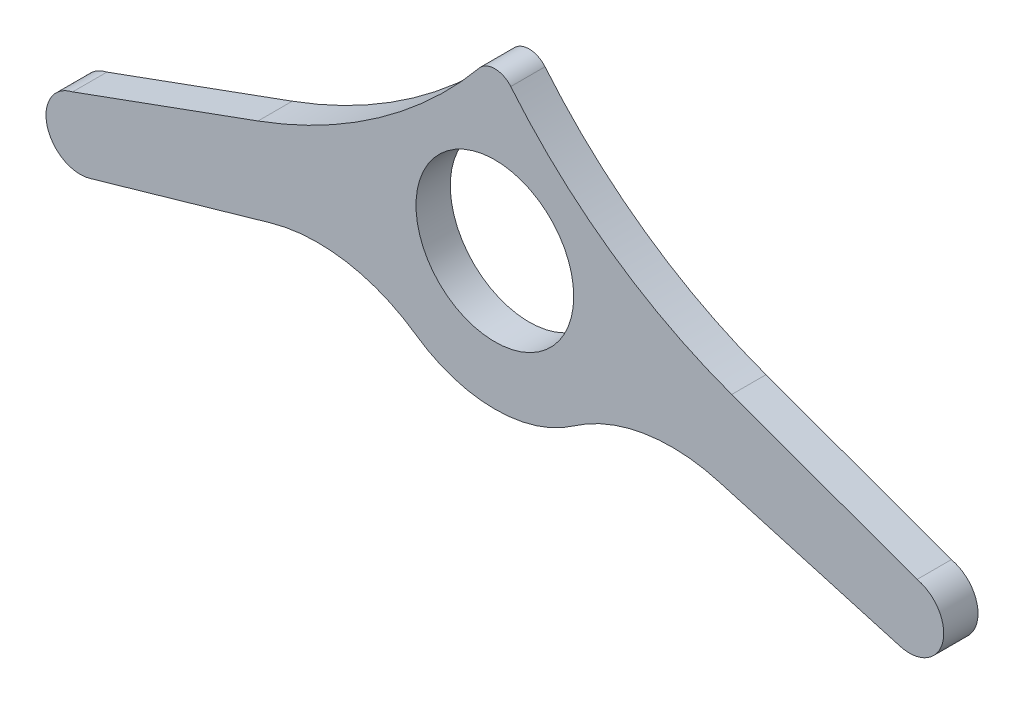
ISO-10303-21;
HEADER;
FILE_DESCRIPTION(('STEP AP214'),'2;1');
FILE_NAME('part.step','',(''),(''),'','','');
FILE_SCHEMA(('AUTOMOTIVE_DESIGN { 1 0 10303 214 1 1 1 1 }'));
ENDSEC;
DATA;
#1=APPLICATION_CONTEXT('core data for automotive mechanical design processes');
#2=APPLICATION_PROTOCOL_DEFINITION('international standard','automotive_design',2000,#1);
#3=PRODUCT_CONTEXT('',#1,'mechanical');
#4=PRODUCT('Part','Part','',(#3));
#5=PRODUCT_RELATED_PRODUCT_CATEGORY('part','',(#4));
#6=PRODUCT_DEFINITION_FORMATION('','',#4);
#7=PRODUCT_DEFINITION_CONTEXT('part definition',#1,'design');
#8=PRODUCT_DEFINITION('design','',#6,#7);
#9=PRODUCT_DEFINITION_SHAPE('','',#8);
#10=(LENGTH_UNIT() NAMED_UNIT(*) SI_UNIT(.MILLI.,.METRE.));
#11=(NAMED_UNIT(*) PLANE_ANGLE_UNIT() SI_UNIT($,.RADIAN.));
#12=(NAMED_UNIT(*) SI_UNIT($,.STERADIAN.) SOLID_ANGLE_UNIT());
#13=UNCERTAINTY_MEASURE_WITH_UNIT(LENGTH_MEASURE(1.E-05),#10,'distance_accuracy_value','');
#14=(GEOMETRIC_REPRESENTATION_CONTEXT(3) GLOBAL_UNCERTAINTY_ASSIGNED_CONTEXT((#13)) GLOBAL_UNIT_ASSIGNED_CONTEXT((#10,
#11,#12)) REPRESENTATION_CONTEXT('',''));
#15=CARTESIAN_POINT('',(0.,0.,0.));
#16=DIRECTION('',(0.,0.,1.));
#17=DIRECTION('',(1.,0.,0.));
#18=AXIS2_PLACEMENT_3D('',#15,#16,#17);
#19=CARTESIAN_POINT('',(60.1925199285785,69.6070614393523,5.));
#20=DIRECTION('',(0.,0.,-1.));
#21=DIRECTION('',(-1.,0.,0.));
#22=AXIS2_PLACEMENT_3D('',#19,#20,#21);
#23=CYLINDRICAL_SURFACE('',#22,75.);
#24=CARTESIAN_POINT('',(60.1925199285785,69.6070614393523,0.));
#25=DIRECTION('',(0.,0.,1.));
#26=DIRECTION('',(1.,0.,0.));
#27=AXIS2_PLACEMENT_3D('',#24,#25,#26);
#28=CIRCLE('',#27,75.);
#29=CARTESIAN_POINT('',(2.31509692032995,21.9079639015136,0.));
#30=VERTEX_POINT('',#29);
#31=CARTESIAN_POINT('',(34.5410091791538,-0.869885119590949,0.));
#32=VERTEX_POINT('',#31);
#33=EDGE_CURVE('E170',#30,#32,#28,.T.);
#34=ORIENTED_EDGE('',*,*,#33,.F.);
#35=DIRECTION('',(0.,0.,-1.));
#36=VECTOR('',#35,1.);
#37=CARTESIAN_POINT('',(2.31509692032995,21.9079639015136,5.));
#38=LINE('',#37,#36);
#39=CARTESIAN_POINT('',(2.31509692032995,21.9079639015136,5.));
#40=VERTEX_POINT('',#39);
#41=EDGE_CURVE('E11',#40,#30,#38,.T.);
#42=ORIENTED_EDGE('',*,*,#41,.F.);
#43=CARTESIAN_POINT('',(60.1925199285785,69.6070614393523,5.));
#44=DIRECTION('',(0.,0.,1.));
#45=DIRECTION('',(1.,0.,0.));
#46=AXIS2_PLACEMENT_3D('',#43,#44,#45);
#47=CIRCLE('',#46,75.);
#48=CARTESIAN_POINT('',(34.5410091791538,-0.869885119590949,5.));
#49=VERTEX_POINT('',#48);
#50=EDGE_CURVE('E216',#40,#49,#47,.T.);
#51=ORIENTED_EDGE('',*,*,#50,.T.);
#52=DIRECTION('',(0.,0.,-1.));
#53=VECTOR('',#52,1.);
#54=CARTESIAN_POINT('',(34.5410091791538,-0.869885119590949,5.));
#55=LINE('',#54,#53);
#56=EDGE_CURVE('E109',#49,#32,#55,.T.);
#57=ORIENTED_EDGE('',*,*,#56,.T.);
#58=EDGE_LOOP('',(#34,#42,#51,#57));
#59=FACE_BOUND('',#58,.T.);
#60=ADVANCED_FACE('F45',(#59),#23,.F.);
#61=CARTESIAN_POINT('',(0.,20.,5.));
#62=DIRECTION('',(0.,0.,-1.));
#63=DIRECTION('',(-1.,0.,0.));
#64=AXIS2_PLACEMENT_3D('',#61,#62,#63);
#65=CYLINDRICAL_SURFACE('',#64,3.);
#66=CARTESIAN_POINT('',(0.,20.,0.));
#67=DIRECTION('',(0.,0.,1.));
#68=DIRECTION('',(1.,0.,0.));
#69=AXIS2_PLACEMENT_3D('',#66,#67,#68);
#70=CIRCLE('',#69,3.);
#71=CARTESIAN_POINT('',(-2.31509692032995,21.9079639015136,0.));
#72=VERTEX_POINT('',#71);
#73=EDGE_CURVE('E174',#72,#30,#70,.F.);
#74=ORIENTED_EDGE('',*,*,#73,.F.);
#75=DIRECTION('',(0.,0.,-1.));
#76=VECTOR('',#75,1.);
#77=CARTESIAN_POINT('',(-2.31509692032995,21.9079639015136,5.));
#78=LINE('',#77,#76);
#79=CARTESIAN_POINT('',(-2.31509692032995,21.9079639015136,5.));
#80=VERTEX_POINT('',#79);
#81=EDGE_CURVE('E54',#80,#72,#78,.T.);
#82=ORIENTED_EDGE('',*,*,#81,.F.);
#83=CARTESIAN_POINT('',(0.,20.,5.));
#84=DIRECTION('',(0.,0.,1.));
#85=DIRECTION('',(1.,0.,0.));
#86=AXIS2_PLACEMENT_3D('',#83,#84,#85);
#87=CIRCLE('',#86,3.);
#88=EDGE_CURVE('E257',#80,#40,#87,.F.);
#89=ORIENTED_EDGE('',*,*,#88,.T.);
#90=ORIENTED_EDGE('',*,*,#41,.T.);
#91=EDGE_LOOP('',(#74,#82,#89,#90));
#92=FACE_BOUND('',#91,.T.);
#93=ADVANCED_FACE('F256',(#92),#65,.T.);
#94=CARTESIAN_POINT('',(-60.1925199285785,69.6070614393523,5.));
#95=DIRECTION('',(0.,0.,-1.));
#96=DIRECTION('',(-1.,0.,0.));
#97=AXIS2_PLACEMENT_3D('',#94,#95,#96);
#98=CYLINDRICAL_SURFACE('',#97,75.);
#99=CARTESIAN_POINT('',(-60.1925199285785,69.6070614393523,0.));
#100=DIRECTION('',(0.,0.,1.));
#101=DIRECTION('',(1.,0.,0.));
#102=AXIS2_PLACEMENT_3D('',#99,#100,#101);
#103=CIRCLE('',#102,75.);
#104=CARTESIAN_POINT('',(-34.5410091791538,-0.869885119590949,0.));
#105=VERTEX_POINT('',#104);
#106=EDGE_CURVE('E178',#72,#105,#103,.F.);
#107=ORIENTED_EDGE('',*,*,#106,.T.);
#108=DIRECTION('',(0.,0.,-1.));
#109=VECTOR('',#108,1.);
#110=CARTESIAN_POINT('',(-34.5410091791538,-0.869885119590949,5.));
#111=LINE('',#110,#109);
#112=CARTESIAN_POINT('',(-34.5410091791538,-0.869885119590949,5.));
#113=VERTEX_POINT('',#112);
#114=EDGE_CURVE('E239',#113,#105,#111,.T.);
#115=ORIENTED_EDGE('',*,*,#114,.F.);
#116=CARTESIAN_POINT('',(-60.1925199285785,69.6070614393523,5.));
#117=DIRECTION('',(0.,0.,1.));
#118=DIRECTION('',(1.,0.,0.));
#119=AXIS2_PLACEMENT_3D('',#116,#117,#118);
#120=CIRCLE('',#119,75.);
#121=EDGE_CURVE('E247',#80,#113,#120,.F.);
#122=ORIENTED_EDGE('',*,*,#121,.F.);
#123=ORIENTED_EDGE('',*,*,#81,.T.);
#124=EDGE_LOOP('',(#107,#115,#122,#123));
#125=FACE_BOUND('',#124,.T.);
#126=ADVANCED_FACE('F245',(#125),#98,.F.);
#127=CARTESIAN_POINT('',(-3.7609548305087,10.3331384724116,5.));
#128=DIRECTION('',(-0.342020143325663,0.93969262078591,0.));
#129=DIRECTION('',(-0.93969262078591,-0.342020143325663,0.));
#130=AXIS2_PLACEMENT_3D('',#127,#128,#129);
#131=PLANE('',#130);
#132=DIRECTION('',(0.939692620785911,0.342020143325663,0.));
#133=VECTOR('',#132,1.);
#134=CARTESIAN_POINT('',(-3.7609548305087,10.3331384724116,0.));
#135=LINE('',#134,#133);
#136=CARTESIAN_POINT('',(-61.5755879459816,-10.7096670866412,0.));
#137=VERTEX_POINT('',#136);
#138=EDGE_CURVE('E182',#137,#105,#135,.T.);
#139=ORIENTED_EDGE('',*,*,#138,.F.);
#140=DIRECTION('',(0.,0.,-1.));
#141=VECTOR('',#140,1.);
#142=CARTESIAN_POINT('',(-61.5755879459816,-10.7096670866412,5.));
#143=LINE('',#142,#141);
#144=CARTESIAN_POINT('',(-61.5755879459816,-10.7096670866412,5.));
#145=VERTEX_POINT('',#144);
#146=EDGE_CURVE('E236',#145,#137,#143,.T.);
#147=ORIENTED_EDGE('',*,*,#146,.F.);
#148=DIRECTION('',(0.939692620785911,0.342020143325663,0.));
#149=VECTOR('',#148,1.);
#150=CARTESIAN_POINT('',(-3.7609548305087,10.3331384724116,5.));
#151=LINE('',#150,#149);
#152=EDGE_CURVE('E268',#145,#113,#151,.T.);
#153=ORIENTED_EDGE('',*,*,#152,.T.);
#154=ORIENTED_EDGE('',*,*,#114,.T.);
#155=EDGE_LOOP('',(#139,#147,#153,#154));
#156=FACE_BOUND('',#155,.T.);
#157=ADVANCED_FACE('F309',(#156),#131,.T.);
#158=CARTESIAN_POINT('',(-60.4587448686565,-15.5833373197028,5.));
#159=DIRECTION('',(0.,0.,-1.));
#160=DIRECTION('',(-1.,0.,0.));
#161=AXIS2_PLACEMENT_3D('',#158,#159,#160);
#162=CYLINDRICAL_SURFACE('',#161,5.);
#163=CARTESIAN_POINT('',(-60.4587448686565,-15.5833373197028,0.));
#164=DIRECTION('',(0.,0.,1.));
#165=DIRECTION('',(1.,0.,0.));
#166=AXIS2_PLACEMENT_3D('',#163,#164,#165);
#167=CIRCLE('',#166,5.);
#168=CARTESIAN_POINT('',(-59.0805580895715,-20.3896457993944,0.));
#169=VERTEX_POINT('',#168);
#170=EDGE_CURVE('E186',#169,#137,#167,.F.);
#171=ORIENTED_EDGE('',*,*,#170,.F.);
#172=DIRECTION('',(0.,0.,-1.));
#173=VECTOR('',#172,1.);
#174=CARTESIAN_POINT('',(-59.0805580895715,-20.3896457993944,5.));
#175=LINE('',#174,#173);
#176=CARTESIAN_POINT('',(-59.0805580895715,-20.3896457993944,5.));
#177=VERTEX_POINT('',#176);
#178=EDGE_CURVE('E233',#177,#169,#175,.T.);
#179=ORIENTED_EDGE('',*,*,#178,.F.);
#180=CARTESIAN_POINT('',(-60.4587448686565,-15.5833373197028,5.));
#181=DIRECTION('',(0.,0.,1.));
#182=DIRECTION('',(1.,0.,0.));
#183=AXIS2_PLACEMENT_3D('',#180,#181,#182);
#184=CIRCLE('',#183,5.);
#185=EDGE_CURVE('E272',#177,#145,#184,.F.);
#186=ORIENTED_EDGE('',*,*,#185,.T.);
#187=ORIENTED_EDGE('',*,*,#146,.T.);
#188=EDGE_LOOP('',(#171,#179,#186,#187));
#189=FACE_BOUND('',#188,.T.);
#190=ADVANCED_FACE('F305',(#189),#162,.T.);
#191=CARTESIAN_POINT('',(0.913731409069728,-3.18656011378087,5.));
#192=DIRECTION('',(0.275637355817,-0.961261695938319,0.));
#193=DIRECTION('',(0.961261695938319,0.275637355817,0.));
#194=AXIS2_PLACEMENT_3D('',#191,#192,#193);
#195=PLANE('',#194);
#196=DIRECTION('',(-0.961261695938319,-0.275637355817,0.));
#197=VECTOR('',#196,1.);
#198=CARTESIAN_POINT('',(0.913731409069728,-3.18656011378087,0.));
#199=LINE('',#198,#197);
#200=CARTESIAN_POINT('',(-32.7065540298084,-12.8270218312732,0.));
#201=VERTEX_POINT('',#200);
#202=EDGE_CURVE('E190',#201,#169,#199,.T.);
#203=ORIENTED_EDGE('',*,*,#202,.F.);
#204=DIRECTION('',(0.,0.,-1.));
#205=VECTOR('',#204,1.);
#206=CARTESIAN_POINT('',(-32.7065540298084,-12.8270218312732,5.));
#207=LINE('',#206,#205);
#208=CARTESIAN_POINT('',(-32.7065540298084,-12.8270218312732,5.));
#209=VERTEX_POINT('',#208);
#210=EDGE_CURVE('E230',#209,#201,#207,.T.);
#211=ORIENTED_EDGE('',*,*,#210,.F.);
#212=DIRECTION('',(-0.961261695938319,-0.275637355817,0.));
#213=VECTOR('',#212,1.);
#214=CARTESIAN_POINT('',(0.913731409069728,-3.18656011378087,5.));
#215=LINE('',#214,#213);
#216=EDGE_CURVE('E276',#209,#177,#215,.T.);
#217=ORIENTED_EDGE('',*,*,#216,.T.);
#218=ORIENTED_EDGE('',*,*,#178,.T.);
#219=EDGE_LOOP('',(#203,#211,#217,#218));
#220=FACE_BOUND('',#219,.T.);
#221=ADVANCED_FACE('F302',(#220),#195,.T.);
#222=CARTESIAN_POINT('',(-25.8156201343834,-36.8585642297312,5.));
#223=DIRECTION('',(0.,0.,-1.));
#224=DIRECTION('',(-1.,0.,0.));
#225=AXIS2_PLACEMENT_3D('',#222,#223,#224);
#226=CYLINDRICAL_SURFACE('',#225,25.);
#227=CARTESIAN_POINT('',(-25.8156201343834,-36.8585642297312,0.));
#228=DIRECTION('',(0.,0.,1.));
#229=DIRECTION('',(1.,0.,0.));
#230=AXIS2_PLACEMENT_3D('',#227,#228,#229);
#231=CIRCLE('',#230,25.);
#232=CARTESIAN_POINT('',(-11.4736089486148,-16.3815841021027,0.));
#233=VERTEX_POINT('',#232);
#234=EDGE_CURVE('E194',#201,#233,#231,.F.);
#235=ORIENTED_EDGE('',*,*,#234,.T.);
#236=DIRECTION('',(0.,0.,-1.));
#237=VECTOR('',#236,1.);
#238=CARTESIAN_POINT('',(-11.4736089486148,-16.3815841021027,5.));
#239=LINE('',#238,#237);
#240=CARTESIAN_POINT('',(-11.4736089486148,-16.3815841021027,5.));
#241=VERTEX_POINT('',#240);
#242=EDGE_CURVE('E226',#241,#233,#239,.T.);
#243=ORIENTED_EDGE('',*,*,#242,.F.);
#244=CARTESIAN_POINT('',(-25.8156201343834,-36.8585642297312,5.));
#245=DIRECTION('',(0.,0.,1.));
#246=DIRECTION('',(1.,0.,0.));
#247=AXIS2_PLACEMENT_3D('',#244,#245,#246);
#248=CIRCLE('',#247,25.);
#249=EDGE_CURVE('E280',#209,#241,#248,.F.);
#250=ORIENTED_EDGE('',*,*,#249,.F.);
#251=ORIENTED_EDGE('',*,*,#210,.T.);
#252=EDGE_LOOP('',(#235,#243,#250,#251));
#253=FACE_BOUND('',#252,.T.);
#254=ADVANCED_FACE('F299',(#253),#226,.F.);
#255=CARTESIAN_POINT('',(0.,0.,5.));
#256=DIRECTION('',(0.,0.,-1.));
#257=DIRECTION('',(-1.,0.,0.));
#258=AXIS2_PLACEMENT_3D('',#255,#256,#257);
#259=CYLINDRICAL_SURFACE('',#258,20.);
#260=CARTESIAN_POINT('',(0.,0.,0.));
#261=DIRECTION('',(0.,0.,1.));
#262=DIRECTION('',(1.,0.,0.));
#263=AXIS2_PLACEMENT_3D('',#260,#261,#262);
#264=CIRCLE('',#263,20.);
#265=CARTESIAN_POINT('',(11.4736089486148,-16.3815841021028,0.));
#266=VERTEX_POINT('',#265);
#267=EDGE_CURVE('E197',#233,#266,#264,.T.);
#268=ORIENTED_EDGE('',*,*,#267,.T.);
#269=DIRECTION('',(0.,0.,-1.));
#270=VECTOR('',#269,1.);
#271=CARTESIAN_POINT('',(11.4736089486148,-16.3815841021028,5.));
#272=LINE('',#271,#270);
#273=CARTESIAN_POINT('',(11.4736089486148,-16.3815841021028,5.));
#274=VERTEX_POINT('',#273);
#275=EDGE_CURVE('E223',#274,#266,#272,.T.);
#276=ORIENTED_EDGE('',*,*,#275,.F.);
#277=CARTESIAN_POINT('',(0.,0.,5.));
#278=DIRECTION('',(0.,0.,1.));
#279=DIRECTION('',(1.,0.,0.));
#280=AXIS2_PLACEMENT_3D('',#277,#278,#279);
#281=CIRCLE('',#280,20.);
#282=EDGE_CURVE('E283',#241,#274,#281,.T.);
#283=ORIENTED_EDGE('',*,*,#282,.F.);
#284=ORIENTED_EDGE('',*,*,#242,.T.);
#285=EDGE_LOOP('',(#268,#276,#283,#284));
#286=FACE_BOUND('',#285,.T.);
#287=ADVANCED_FACE('F294',(#286),#259,.T.);
#288=CARTESIAN_POINT('',(25.8156201343834,-36.8585642297312,5.));
#289=DIRECTION('',(0.,0.,-1.));
#290=DIRECTION('',(-1.,0.,0.));
#291=AXIS2_PLACEMENT_3D('',#288,#289,#290);
#292=CYLINDRICAL_SURFACE('',#291,25.);
#293=CARTESIAN_POINT('',(25.8156201343834,-36.8585642297312,0.));
#294=DIRECTION('',(0.,0.,1.));
#295=DIRECTION('',(1.,0.,0.));
#296=AXIS2_PLACEMENT_3D('',#293,#294,#295);
#297=CIRCLE('',#296,25.);
#298=CARTESIAN_POINT('',(32.7065540298084,-12.8270218312732,0.));
#299=VERTEX_POINT('',#298);
#300=EDGE_CURVE('E201',#299,#266,#297,.T.);
#301=ORIENTED_EDGE('',*,*,#300,.F.);
#302=DIRECTION('',(0.,0.,-1.));
#303=VECTOR('',#302,1.);
#304=CARTESIAN_POINT('',(32.7065540298084,-12.8270218312732,5.));
#305=LINE('',#304,#303);
#306=CARTESIAN_POINT('',(32.7065540298084,-12.8270218312732,5.));
#307=VERTEX_POINT('',#306);
#308=EDGE_CURVE('E156',#307,#299,#305,.T.);
#309=ORIENTED_EDGE('',*,*,#308,.F.);
#310=CARTESIAN_POINT('',(25.8156201343834,-36.8585642297312,5.));
#311=DIRECTION('',(0.,0.,1.));
#312=DIRECTION('',(1.,0.,0.));
#313=AXIS2_PLACEMENT_3D('',#310,#311,#312);
#314=CIRCLE('',#313,25.);
#315=EDGE_CURVE('E147',#307,#274,#314,.T.);
#316=ORIENTED_EDGE('',*,*,#315,.T.);
#317=ORIENTED_EDGE('',*,*,#275,.T.);
#318=EDGE_LOOP('',(#301,#309,#316,#317));
#319=FACE_BOUND('',#318,.T.);
#320=ADVANCED_FACE('F288',(#319),#292,.F.);
#321=CARTESIAN_POINT('',(-0.913731409069728,-3.18656011378087,5.));
#322=DIRECTION('',(0.275637355817,0.961261695938319,0.));
#323=DIRECTION('',(-0.961261695938319,0.275637355817,0.));
#324=AXIS2_PLACEMENT_3D('',#321,#322,#323);
#325=PLANE('',#324);
#326=DIRECTION('',(0.961261695938319,-0.275637355817,0.));
#327=VECTOR('',#326,1.);
#328=CARTESIAN_POINT('',(-0.913731409069728,-3.18656011378087,0.));
#329=LINE('',#328,#327);
#330=CARTESIAN_POINT('',(59.0805580895715,-20.3896457993944,0.));
#331=VERTEX_POINT('',#330);
#332=EDGE_CURVE('E154',#299,#331,#329,.T.);
#333=ORIENTED_EDGE('',*,*,#332,.T.);
#334=DIRECTION('',(0.,0.,-1.));
#335=VECTOR('',#334,1.);
#336=CARTESIAN_POINT('',(59.0805580895715,-20.3896457993944,5.));
#337=LINE('',#336,#335);
#338=CARTESIAN_POINT('',(59.0805580895715,-20.3896457993944,5.));
#339=VERTEX_POINT('',#338);
#340=EDGE_CURVE('E151',#339,#331,#337,.T.);
#341=ORIENTED_EDGE('',*,*,#340,.F.);
#342=DIRECTION('',(0.961261695938319,-0.275637355817,0.));
#343=VECTOR('',#342,1.);
#344=CARTESIAN_POINT('',(-0.913731409069728,-3.18656011378087,5.));
#345=LINE('',#344,#343);
#346=EDGE_CURVE('E140',#307,#339,#345,.T.);
#347=ORIENTED_EDGE('',*,*,#346,.F.);
#348=ORIENTED_EDGE('',*,*,#308,.T.);
#349=EDGE_LOOP('',(#333,#341,#347,#348));
#350=FACE_BOUND('',#349,.T.);
#351=ADVANCED_FACE('F152',(#350),#325,.F.);
#352=CARTESIAN_POINT('',(60.4587448686565,-15.5833373197028,5.));
#353=DIRECTION('',(0.,0.,-1.));
#354=DIRECTION('',(-1.,0.,0.));
#355=AXIS2_PLACEMENT_3D('',#352,#353,#354);
#356=CYLINDRICAL_SURFACE('',#355,5.);
#357=CARTESIAN_POINT('',(60.4587448686565,-15.5833373197028,0.));
#358=DIRECTION('',(0.,0.,1.));
#359=DIRECTION('',(1.,0.,0.));
#360=AXIS2_PLACEMENT_3D('',#357,#358,#359);
#361=CIRCLE('',#360,5.);
#362=CARTESIAN_POINT('',(61.5755879459816,-10.7096670866412,0.));
#363=VERTEX_POINT('',#362);
#364=EDGE_CURVE('E102',#331,#363,#361,.T.);
#365=ORIENTED_EDGE('',*,*,#364,.T.);
#366=DIRECTION('',(0.,0.,-1.));
#367=VECTOR('',#366,1.);
#368=CARTESIAN_POINT('',(61.5755879459816,-10.7096670866412,5.));
#369=LINE('',#368,#367);
#370=CARTESIAN_POINT('',(61.5755879459816,-10.7096670866412,5.));
#371=VERTEX_POINT('',#370);
#372=EDGE_CURVE('E157',#371,#363,#369,.T.);
#373=ORIENTED_EDGE('',*,*,#372,.F.);
#374=CARTESIAN_POINT('',(60.4587448686565,-15.5833373197028,5.));
#375=DIRECTION('',(0.,0.,1.));
#376=DIRECTION('',(1.,0.,0.));
#377=AXIS2_PLACEMENT_3D('',#374,#375,#376);
#378=CIRCLE('',#377,5.);
#379=EDGE_CURVE('E145',#339,#371,#378,.T.);
#380=ORIENTED_EDGE('',*,*,#379,.F.);
#381=ORIENTED_EDGE('',*,*,#340,.T.);
#382=EDGE_LOOP('',(#365,#373,#380,#381));
#383=FACE_BOUND('',#382,.T.);
#384=ADVANCED_FACE('F159',(#383),#356,.T.);
#385=CARTESIAN_POINT('',(3.7609548305087,10.3331384724116,5.));
#386=DIRECTION('',(-0.342020143325663,-0.93969262078591,0.));
#387=DIRECTION('',(0.93969262078591,-0.342020143325663,0.));
#388=AXIS2_PLACEMENT_3D('',#385,#386,#387);
#389=PLANE('',#388);
#390=DIRECTION('',(-0.939692620785911,0.342020143325663,0.));
#391=VECTOR('',#390,1.);
#392=CARTESIAN_POINT('',(3.7609548305087,10.3331384724116,0.));
#393=LINE('',#392,#391);
#394=EDGE_CURVE('E209',#363,#32,#393,.T.);
#395=ORIENTED_EDGE('',*,*,#394,.T.);
#396=ORIENTED_EDGE('',*,*,#56,.F.);
#397=DIRECTION('',(-0.939692620785911,0.342020143325663,0.));
#398=VECTOR('',#397,1.);
#399=CARTESIAN_POINT('',(3.7609548305087,10.3331384724116,5.));
#400=LINE('',#399,#398);
#401=EDGE_CURVE('E62',#371,#49,#400,.T.);
#402=ORIENTED_EDGE('',*,*,#401,.F.);
#403=ORIENTED_EDGE('',*,*,#372,.T.);
#404=EDGE_LOOP('',(#395,#396,#402,#403));
#405=FACE_BOUND('',#404,.T.);
#406=ADVANCED_FACE('F260',(#405),#389,.F.);
#407=CARTESIAN_POINT('',(0.,0.,5.));
#408=DIRECTION('',(0.,0.,-1.));
#409=DIRECTION('',(-1.,0.,0.));
#410=AXIS2_PLACEMENT_3D('',#407,#408,#409);
#411=CYLINDRICAL_SURFACE('',#410,11.5);
#412=CARTESIAN_POINT('',(0.,0.,5.));
#413=DIRECTION('',(0.,0.,1.));
#414=DIRECTION('',(1.,0.,0.));
#415=AXIS2_PLACEMENT_3D('',#412,#413,#414);
#416=CIRCLE('',#415,11.5);
#417=CARTESIAN_POINT('',(11.5,0.,5.));
#418=VERTEX_POINT('',#417);
#419=EDGE_CURVE('E163',#418,#418,#416,.T.);
#420=ORIENTED_EDGE('',*,*,#419,.T.);
#421=EDGE_LOOP('',(#420));
#422=FACE_BOUND('',#421,.T.);
#423=CARTESIAN_POINT('',(0.,0.,0.));
#424=DIRECTION('',(0.,0.,1.));
#425=DIRECTION('',(1.,0.,0.));
#426=AXIS2_PLACEMENT_3D('',#423,#424,#425);
#427=CIRCLE('',#426,11.5);
#428=CARTESIAN_POINT('',(11.5,0.,0.));
#429=VERTEX_POINT('',#428);
#430=EDGE_CURVE('E212',#429,#429,#427,.T.);
#431=ORIENTED_EDGE('',*,*,#430,.F.);
#432=EDGE_LOOP('',(#431));
#433=FACE_BOUND('',#432,.T.);
#434=ADVANCED_FACE('F404',(#422,#433),#411,.F.);
#435=CARTESIAN_POINT('',(0.,0.,5.));
#436=DIRECTION('',(0.,0.,1.));
#437=DIRECTION('',(1.,0.,0.));
#438=AXIS2_PLACEMENT_3D('',#435,#436,#437);
#439=PLANE('',#438);
#440=ORIENTED_EDGE('',*,*,#50,.F.);
#441=ORIENTED_EDGE('',*,*,#88,.F.);
#442=ORIENTED_EDGE('',*,*,#121,.T.);
#443=ORIENTED_EDGE('',*,*,#152,.F.);
#444=ORIENTED_EDGE('',*,*,#185,.F.);
#445=ORIENTED_EDGE('',*,*,#216,.F.);
#446=ORIENTED_EDGE('',*,*,#249,.T.);
#447=ORIENTED_EDGE('',*,*,#282,.T.);
#448=ORIENTED_EDGE('',*,*,#315,.F.);
#449=ORIENTED_EDGE('',*,*,#346,.T.);
#450=ORIENTED_EDGE('',*,*,#379,.T.);
#451=ORIENTED_EDGE('',*,*,#401,.T.);
#452=EDGE_LOOP('',(#440,#441,#442,#443,#444,#445,#446,#447,#448,#449,#450,#451));
#453=FACE_BOUND('',#452,.T.);
#454=ORIENTED_EDGE('',*,*,#419,.F.);
#455=EDGE_LOOP('',(#454));
#456=FACE_BOUND('',#455,.T.);
#457=ADVANCED_FACE('F142',(#453,#456),#439,.T.);
#458=CARTESIAN_POINT('',(0.,0.,0.));
#459=DIRECTION('',(0.,0.,1.));
#460=DIRECTION('',(1.,0.,0.));
#461=AXIS2_PLACEMENT_3D('',#458,#459,#460);
#462=PLANE('',#461);
#463=ORIENTED_EDGE('',*,*,#33,.T.);
#464=ORIENTED_EDGE('',*,*,#394,.F.);
#465=ORIENTED_EDGE('',*,*,#364,.F.);
#466=ORIENTED_EDGE('',*,*,#332,.F.);
#467=ORIENTED_EDGE('',*,*,#300,.T.);
#468=ORIENTED_EDGE('',*,*,#267,.F.);
#469=ORIENTED_EDGE('',*,*,#234,.F.);
#470=ORIENTED_EDGE('',*,*,#202,.T.);
#471=ORIENTED_EDGE('',*,*,#170,.T.);
#472=ORIENTED_EDGE('',*,*,#138,.T.);
#473=ORIENTED_EDGE('',*,*,#106,.F.);
#474=ORIENTED_EDGE('',*,*,#73,.T.);
#475=EDGE_LOOP('',(#463,#464,#465,#466,#467,#468,#469,#470,#471,#472,#473,#474));
#476=FACE_BOUND('',#475,.T.);
#477=ORIENTED_EDGE('',*,*,#430,.T.);
#478=EDGE_LOOP('',(#477));
#479=FACE_BOUND('',#478,.T.);
#480=ADVANCED_FACE('F253',(#476,#479),#462,.F.);
#481=CLOSED_SHELL('',(#60,#93,#126,#157,#190,#221,#254,#287,#320,#351,#384,#406,#434,#457,#480));
#482=MANIFOLD_SOLID_BREP('B2',#481);
#483=ADVANCED_BREP_SHAPE_REPRESENTATION('',(#18,#482),#14);
#484=SHAPE_DEFINITION_REPRESENTATION(#9,#483);
ENDSEC;
END-ISO-10303-21;
